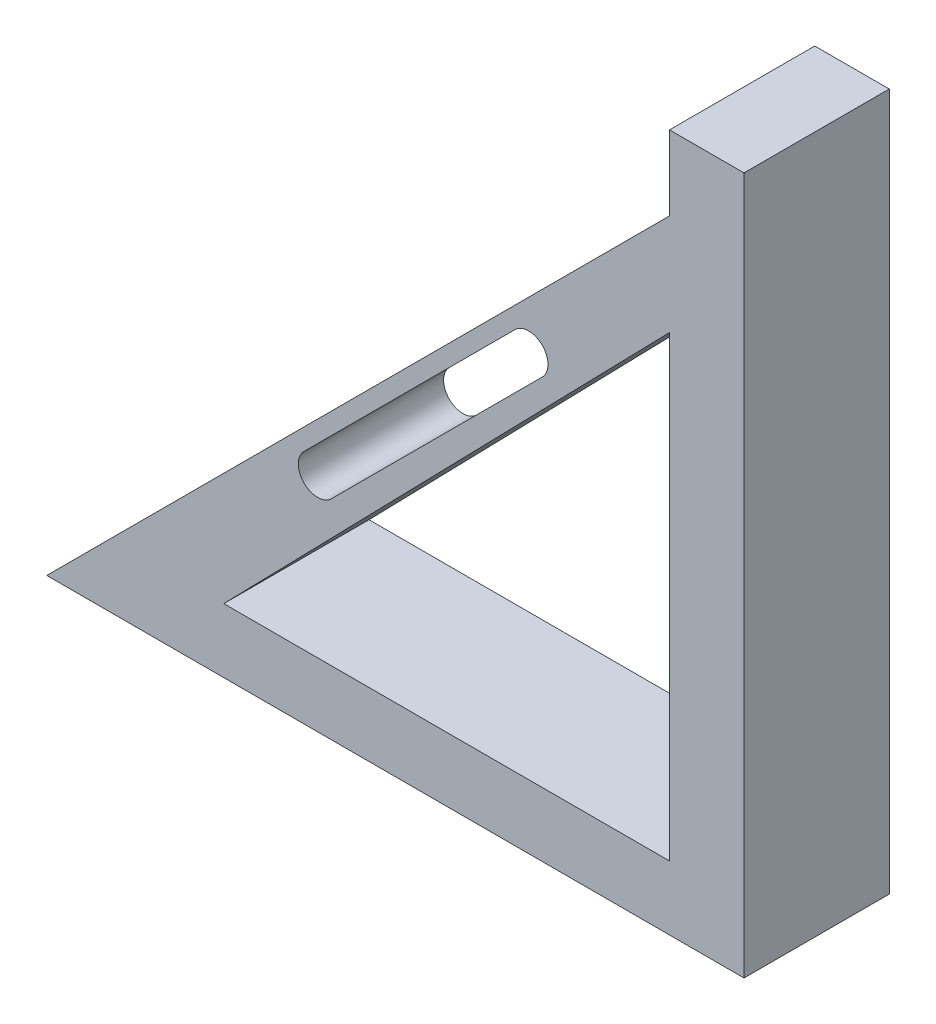
ISO-10303-21;
HEADER;
FILE_DESCRIPTION(('STEP AP214'),'2;1');
FILE_NAME('part.step','',(''),(''),'','','');
FILE_SCHEMA(('AUTOMOTIVE_DESIGN { 1 0 10303 214 1 1 1 1 }'));
ENDSEC;
DATA;
#1=APPLICATION_CONTEXT('core data for automotive mechanical design processes');
#2=APPLICATION_PROTOCOL_DEFINITION('international standard','automotive_design',2000,#1);
#3=PRODUCT_CONTEXT('',#1,'mechanical');
#4=PRODUCT('Part','Part','',(#3));
#5=PRODUCT_RELATED_PRODUCT_CATEGORY('part','',(#4));
#6=PRODUCT_DEFINITION_FORMATION('','',#4);
#7=PRODUCT_DEFINITION_CONTEXT('part definition',#1,'design');
#8=PRODUCT_DEFINITION('design','',#6,#7);
#9=PRODUCT_DEFINITION_SHAPE('','',#8);
#10=(LENGTH_UNIT() NAMED_UNIT(*) SI_UNIT(.MILLI.,.METRE.));
#11=(NAMED_UNIT(*) PLANE_ANGLE_UNIT() SI_UNIT($,.RADIAN.));
#12=(NAMED_UNIT(*) SI_UNIT($,.STERADIAN.) SOLID_ANGLE_UNIT());
#13=UNCERTAINTY_MEASURE_WITH_UNIT(LENGTH_MEASURE(1.E-05),#10,'distance_accuracy_value','');
#14=(GEOMETRIC_REPRESENTATION_CONTEXT(3) GLOBAL_UNCERTAINTY_ASSIGNED_CONTEXT((#13)) GLOBAL_UNIT_ASSIGNED_CONTEXT((#10,
#11,#12)) REPRESENTATION_CONTEXT('',''));
#15=CARTESIAN_POINT('',(0.,0.,0.));
#16=DIRECTION('',(0.,0.,1.));
#17=DIRECTION('',(1.,0.,0.));
#18=AXIS2_PLACEMENT_3D('',#15,#16,#17);
#19=CARTESIAN_POINT('',(0.,0.,25.));
#20=DIRECTION('',(0.,0.,1.));
#21=DIRECTION('',(1.,0.,0.));
#22=AXIS2_PLACEMENT_3D('',#19,#20,#21);
#23=PLANE('',#22);
#24=CARTESIAN_POINT('',(22.9410613723644,74.5825493904846,25.));
#25=DIRECTION('',(0.,0.,1.));
#26=DIRECTION('',(1.,0.,0.));
#27=AXIS2_PLACEMENT_3D('',#24,#25,#26);
#28=CIRCLE('',#27,3.32826489939381);
#29=CARTESIAN_POINT('',(25.294500052311,72.2291107105381,25.));
#30=VERTEX_POINT('',#29);
#31=CARTESIAN_POINT('',(20.5876226924178,76.9359880704311,25.));
#32=VERTEX_POINT('',#31);
#33=EDGE_CURVE('E48',#30,#32,#28,.T.);
#34=ORIENTED_EDGE('',*,*,#33,.F.);
#35=DIRECTION('',(0.707106781186541,0.707106781186554,0.));
#36=VECTOR('',#35,1.);
#37=CARTESIAN_POINT('',(25.294500052311,72.2291107105381,25.));
#38=LINE('',#37,#36);
#39=CARTESIAN_POINT('',(-11.0224268112802,35.9121838469463,25.));
#40=VERTEX_POINT('',#39);
#41=EDGE_CURVE('E140',#40,#30,#38,.T.);
#42=ORIENTED_EDGE('',*,*,#41,.F.);
#43=CARTESIAN_POINT('',(-13.3758654912267,38.2656225268928,25.));
#44=DIRECTION('',(0.,0.,1.));
#45=DIRECTION('',(1.,0.,0.));
#46=AXIS2_PLACEMENT_3D('',#43,#44,#45);
#47=CIRCLE('',#46,3.32826489939382);
#48=CARTESIAN_POINT('',(-15.7293041711733,40.6190612068393,25.));
#49=VERTEX_POINT('',#48);
#50=EDGE_CURVE('E143',#49,#40,#47,.T.);
#51=ORIENTED_EDGE('',*,*,#50,.F.);
#52=DIRECTION('',(-0.707106781186541,-0.707106781186554,0.));
#53=VECTOR('',#52,1.);
#54=CARTESIAN_POINT('',(20.5876226924179,76.9359880704311,25.));
#55=LINE('',#54,#53);
#56=EDGE_CURVE('E149',#32,#49,#55,.T.);
#57=ORIENTED_EDGE('',*,*,#56,.F.);
#58=EDGE_LOOP('',(#34,#42,#51,#57));
#59=FACE_BOUND('',#58,.T.);
#60=DIRECTION('',(0.,1.,0.));
#61=VECTOR('',#60,1.);
#62=CARTESIAN_POINT('',(60.,120.,25.));
#63=LINE('',#62,#61);
#64=CARTESIAN_POINT('',(60.,0.,25.));
#65=VERTEX_POINT('',#64);
#66=CARTESIAN_POINT('',(60.,120.,25.));
#67=VERTEX_POINT('',#66);
#68=EDGE_CURVE('E183',#65,#67,#63,.T.);
#69=ORIENTED_EDGE('',*,*,#68,.T.);
#70=DIRECTION('',(-1.,0.,0.));
#71=VECTOR('',#70,1.);
#72=CARTESIAN_POINT('',(47.1770110419047,120.,25.));
#73=LINE('',#72,#71);
#74=CARTESIAN_POINT('',(47.1770110419047,120.,25.));
#75=VERTEX_POINT('',#74);
#76=EDGE_CURVE('E186',#67,#75,#73,.T.);
#77=ORIENTED_EDGE('',*,*,#76,.T.);
#78=DIRECTION('',(0.,-1.,0.));
#79=VECTOR('',#78,1.);
#80=CARTESIAN_POINT('',(47.1770110419048,107.177011041905,25.));
#81=LINE('',#80,#79);
#82=CARTESIAN_POINT('',(47.1770110419048,107.177011041905,25.));
#83=VERTEX_POINT('',#82);
#84=EDGE_CURVE('E189',#75,#83,#81,.T.);
#85=ORIENTED_EDGE('',*,*,#84,.T.);
#86=DIRECTION('',(-0.707106781186547,-0.707106781186547,0.));
#87=VECTOR('',#86,1.);
#88=CARTESIAN_POINT('',(47.1770110419048,107.177011041905,25.));
#89=LINE('',#88,#87);
#90=CARTESIAN_POINT('',(-60.,0.,25.));
#91=VERTEX_POINT('',#90);
#92=EDGE_CURVE('E191',#83,#91,#89,.T.);
#93=ORIENTED_EDGE('',*,*,#92,.T.);
#94=DIRECTION('',(1.,0.,0.));
#95=VECTOR('',#94,1.);
#96=CARTESIAN_POINT('',(-60.,0.,25.));
#97=LINE('',#96,#95);
#98=EDGE_CURVE('E193',#91,#65,#97,.T.);
#99=ORIENTED_EDGE('',*,*,#98,.T.);
#100=EDGE_LOOP('',(#69,#77,#85,#93,#99));
#101=FACE_BOUND('',#100,.T.);
#102=DIRECTION('',(1.,0.,0.));
#103=VECTOR('',#102,1.);
#104=CARTESIAN_POINT('',(-29.533576018103,11.0330752600284,25.));
#105=LINE('',#104,#103);
#106=CARTESIAN_POINT('',(-29.533576018103,11.0330752600284,25.));
#107=VERTEX_POINT('',#106);
#108=CARTESIAN_POINT('',(47.1770110419047,11.0330752600284,25.));
#109=VERTEX_POINT('',#108);
#110=EDGE_CURVE('E161',#107,#109,#105,.T.);
#111=ORIENTED_EDGE('',*,*,#110,.F.);
#112=DIRECTION('',(-0.697742347072111,-0.7163488096607,0.));
#113=VECTOR('',#112,1.);
#114=CARTESIAN_POINT('',(47.1770110419047,89.7892779749697,25.));
#115=LINE('',#114,#113);
#116=CARTESIAN_POINT('',(47.1770110419047,89.7892779749697,25.));
#117=VERTEX_POINT('',#116);
#118=EDGE_CURVE('E159',#117,#107,#115,.T.);
#119=ORIENTED_EDGE('',*,*,#118,.F.);
#120=DIRECTION('',(0.,1.,0.));
#121=VECTOR('',#120,1.);
#122=CARTESIAN_POINT('',(47.1770110419047,89.7892779749697,25.));
#123=LINE('',#122,#121);
#124=EDGE_CURVE('E165',#109,#117,#123,.T.);
#125=ORIENTED_EDGE('',*,*,#124,.F.);
#126=EDGE_LOOP('',(#111,#119,#125));
#127=FACE_BOUND('',#126,.T.);
#128=ADVANCED_FACE('F33',(#59,#101,#127),#23,.T.);
#129=CARTESIAN_POINT('',(0.,0.,0.));
#130=DIRECTION('',(0.,0.,1.));
#131=DIRECTION('',(1.,0.,0.));
#132=AXIS2_PLACEMENT_3D('',#129,#130,#131);
#133=PLANE('',#132);
#134=DIRECTION('',(0.707106781186541,0.707106781186554,0.));
#135=VECTOR('',#134,1.);
#136=CARTESIAN_POINT('',(25.294500052311,72.2291107105381,0.));
#137=LINE('',#136,#135);
#138=CARTESIAN_POINT('',(-11.0224268112802,35.9121838469463,0.));
#139=VERTEX_POINT('',#138);
#140=CARTESIAN_POINT('',(25.294500052311,72.2291107105381,0.));
#141=VERTEX_POINT('',#140);
#142=EDGE_CURVE('E130',#139,#141,#137,.T.);
#143=ORIENTED_EDGE('',*,*,#142,.T.);
#144=CARTESIAN_POINT('',(22.9410613723644,74.5825493904846,0.));
#145=DIRECTION('',(0.,0.,1.));
#146=DIRECTION('',(1.,0.,0.));
#147=AXIS2_PLACEMENT_3D('',#144,#145,#146);
#148=CIRCLE('',#147,3.32826489939381);
#149=CARTESIAN_POINT('',(20.5876226924179,76.9359880704311,0.));
#150=VERTEX_POINT('',#149);
#151=EDGE_CURVE('E124',#141,#150,#148,.T.);
#152=ORIENTED_EDGE('',*,*,#151,.T.);
#153=DIRECTION('',(-0.707106781186541,-0.707106781186554,0.));
#154=VECTOR('',#153,1.);
#155=CARTESIAN_POINT('',(20.5876226924179,76.9359880704311,0.));
#156=LINE('',#155,#154);
#157=CARTESIAN_POINT('',(-15.7293041711733,40.6190612068393,0.));
#158=VERTEX_POINT('',#157);
#159=EDGE_CURVE('E133',#150,#158,#156,.T.);
#160=ORIENTED_EDGE('',*,*,#159,.T.);
#161=CARTESIAN_POINT('',(-13.3758654912267,38.2656225268928,0.));
#162=DIRECTION('',(0.,0.,1.));
#163=DIRECTION('',(1.,0.,0.));
#164=AXIS2_PLACEMENT_3D('',#161,#162,#163);
#165=CIRCLE('',#164,3.32826489939382);
#166=EDGE_CURVE('E56',#158,#139,#165,.T.);
#167=ORIENTED_EDGE('',*,*,#166,.T.);
#168=EDGE_LOOP('',(#143,#152,#160,#167));
#169=FACE_BOUND('',#168,.T.);
#170=DIRECTION('',(0.,1.,0.));
#171=VECTOR('',#170,1.);
#172=CARTESIAN_POINT('',(60.,120.,0.));
#173=LINE('',#172,#171);
#174=CARTESIAN_POINT('',(60.,0.,0.));
#175=VERTEX_POINT('',#174);
#176=CARTESIAN_POINT('',(60.,120.,0.));
#177=VERTEX_POINT('',#176);
#178=EDGE_CURVE('E182',#175,#177,#173,.T.);
#179=ORIENTED_EDGE('',*,*,#178,.F.);
#180=DIRECTION('',(1.,0.,0.));
#181=VECTOR('',#180,1.);
#182=CARTESIAN_POINT('',(-60.,0.,0.));
#183=LINE('',#182,#181);
#184=CARTESIAN_POINT('',(-60.,0.,0.));
#185=VERTEX_POINT('',#184);
#186=EDGE_CURVE('E187',#185,#175,#183,.T.);
#187=ORIENTED_EDGE('',*,*,#186,.F.);
#188=DIRECTION('',(-0.707106781186547,-0.707106781186547,0.));
#189=VECTOR('',#188,1.);
#190=CARTESIAN_POINT('',(47.1770110419048,107.177011041905,0.));
#191=LINE('',#190,#189);
#192=CARTESIAN_POINT('',(47.1770110419048,107.177011041905,0.));
#193=VERTEX_POINT('',#192);
#194=EDGE_CURVE('E202',#193,#185,#191,.T.);
#195=ORIENTED_EDGE('',*,*,#194,.F.);
#196=DIRECTION('',(0.,-1.,0.));
#197=VECTOR('',#196,1.);
#198=CARTESIAN_POINT('',(47.1770110419048,107.177011041905,0.));
#199=LINE('',#198,#197);
#200=CARTESIAN_POINT('',(47.1770110419047,120.,0.));
#201=VERTEX_POINT('',#200);
#202=EDGE_CURVE('E200',#201,#193,#199,.T.);
#203=ORIENTED_EDGE('',*,*,#202,.F.);
#204=DIRECTION('',(-1.,0.,0.));
#205=VECTOR('',#204,1.);
#206=CARTESIAN_POINT('',(47.1770110419047,120.,0.));
#207=LINE('',#206,#205);
#208=EDGE_CURVE('E198',#177,#201,#207,.T.);
#209=ORIENTED_EDGE('',*,*,#208,.F.);
#210=EDGE_LOOP('',(#179,#187,#195,#203,#209));
#211=FACE_BOUND('',#210,.T.);
#212=DIRECTION('',(-0.697742347072111,-0.7163488096607,0.));
#213=VECTOR('',#212,1.);
#214=CARTESIAN_POINT('',(47.1770110419047,89.7892779749697,0.));
#215=LINE('',#214,#213);
#216=CARTESIAN_POINT('',(47.1770110419047,89.7892779749697,0.));
#217=VERTEX_POINT('',#216);
#218=CARTESIAN_POINT('',(-29.533576018103,11.0330752600284,0.));
#219=VERTEX_POINT('',#218);
#220=EDGE_CURVE('E155',#217,#219,#215,.T.);
#221=ORIENTED_EDGE('',*,*,#220,.T.);
#222=DIRECTION('',(1.,0.,0.));
#223=VECTOR('',#222,1.);
#224=CARTESIAN_POINT('',(-29.533576018103,11.0330752600284,0.));
#225=LINE('',#224,#223);
#226=CARTESIAN_POINT('',(47.1770110419047,11.0330752600284,0.));
#227=VERTEX_POINT('',#226);
#228=EDGE_CURVE('E170',#219,#227,#225,.T.);
#229=ORIENTED_EDGE('',*,*,#228,.T.);
#230=DIRECTION('',(0.,1.,0.));
#231=VECTOR('',#230,1.);
#232=CARTESIAN_POINT('',(47.1770110419047,89.7892779749697,0.));
#233=LINE('',#232,#231);
#234=EDGE_CURVE('E162',#227,#217,#233,.T.);
#235=ORIENTED_EDGE('',*,*,#234,.T.);
#236=EDGE_LOOP('',(#221,#229,#235));
#237=FACE_BOUND('',#236,.T.);
#238=ADVANCED_FACE('F137',(#169,#211,#237),#133,.F.);
#239=CARTESIAN_POINT('',(60.,120.,25.));
#240=DIRECTION('',(-1.,0.,0.));
#241=DIRECTION('',(0.,-1.,0.));
#242=AXIS2_PLACEMENT_3D('',#239,#240,#241);
#243=PLANE('',#242);
#244=ORIENTED_EDGE('',*,*,#178,.T.);
#245=DIRECTION('',(0.,0.,-1.));
#246=VECTOR('',#245,1.);
#247=CARTESIAN_POINT('',(60.,120.,25.));
#248=LINE('',#247,#246);
#249=EDGE_CURVE('E11',#67,#177,#248,.T.);
#250=ORIENTED_EDGE('',*,*,#249,.F.);
#251=ORIENTED_EDGE('',*,*,#68,.F.);
#252=DIRECTION('',(0.,0.,-1.));
#253=VECTOR('',#252,1.);
#254=CARTESIAN_POINT('',(60.,0.,25.));
#255=LINE('',#254,#253);
#256=EDGE_CURVE('E195',#65,#175,#255,.T.);
#257=ORIENTED_EDGE('',*,*,#256,.T.);
#258=EDGE_LOOP('',(#244,#250,#251,#257));
#259=FACE_BOUND('',#258,.T.);
#260=ADVANCED_FACE('F35',(#259),#243,.F.);
#261=CARTESIAN_POINT('',(47.1770110419047,120.,25.));
#262=DIRECTION('',(0.,-1.,0.));
#263=DIRECTION('',(0.,0.,-1.));
#264=AXIS2_PLACEMENT_3D('',#261,#262,#263);
#265=PLANE('',#264);
#266=ORIENTED_EDGE('',*,*,#208,.T.);
#267=DIRECTION('',(0.,0.,-1.));
#268=VECTOR('',#267,1.);
#269=CARTESIAN_POINT('',(47.1770110419047,120.,25.));
#270=LINE('',#269,#268);
#271=EDGE_CURVE('E41',#75,#201,#270,.T.);
#272=ORIENTED_EDGE('',*,*,#271,.F.);
#273=ORIENTED_EDGE('',*,*,#76,.F.);
#274=ORIENTED_EDGE('',*,*,#249,.T.);
#275=EDGE_LOOP('',(#266,#272,#273,#274));
#276=FACE_BOUND('',#275,.T.);
#277=ADVANCED_FACE('F236',(#276),#265,.F.);
#278=CARTESIAN_POINT('',(47.1770110419048,107.177011041905,25.));
#279=DIRECTION('',(1.,0.,0.));
#280=DIRECTION('',(0.,1.,0.));
#281=AXIS2_PLACEMENT_3D('',#278,#279,#280);
#282=PLANE('',#281);
#283=ORIENTED_EDGE('',*,*,#202,.T.);
#284=DIRECTION('',(0.,0.,-1.));
#285=VECTOR('',#284,1.);
#286=CARTESIAN_POINT('',(47.1770110419048,107.177011041905,25.));
#287=LINE('',#286,#285);
#288=EDGE_CURVE('E210',#83,#193,#287,.T.);
#289=ORIENTED_EDGE('',*,*,#288,.F.);
#290=ORIENTED_EDGE('',*,*,#84,.F.);
#291=ORIENTED_EDGE('',*,*,#271,.T.);
#292=EDGE_LOOP('',(#283,#289,#290,#291));
#293=FACE_BOUND('',#292,.T.);
#294=ADVANCED_FACE('F217',(#293),#282,.F.);
#295=CARTESIAN_POINT('',(47.1770110419048,107.177011041905,25.));
#296=DIRECTION('',(0.707106781186547,-0.707106781186547,0.));
#297=DIRECTION('',(0.707106781186548,0.707106781186548,0.));
#298=AXIS2_PLACEMENT_3D('',#295,#296,#297);
#299=PLANE('',#298);
#300=ORIENTED_EDGE('',*,*,#194,.T.);
#301=DIRECTION('',(0.,0.,-1.));
#302=VECTOR('',#301,1.);
#303=CARTESIAN_POINT('',(-60.,0.,25.));
#304=LINE('',#303,#302);
#305=EDGE_CURVE('E207',#91,#185,#304,.T.);
#306=ORIENTED_EDGE('',*,*,#305,.F.);
#307=ORIENTED_EDGE('',*,*,#92,.F.);
#308=ORIENTED_EDGE('',*,*,#288,.T.);
#309=EDGE_LOOP('',(#300,#306,#307,#308));
#310=FACE_BOUND('',#309,.T.);
#311=ADVANCED_FACE('F226',(#310),#299,.F.);
#312=CARTESIAN_POINT('',(-60.,0.,25.));
#313=DIRECTION('',(0.,1.,0.));
#314=DIRECTION('',(0.,0.,1.));
#315=AXIS2_PLACEMENT_3D('',#312,#313,#314);
#316=PLANE('',#315);
#317=ORIENTED_EDGE('',*,*,#186,.T.);
#318=ORIENTED_EDGE('',*,*,#256,.F.);
#319=ORIENTED_EDGE('',*,*,#98,.F.);
#320=ORIENTED_EDGE('',*,*,#305,.T.);
#321=EDGE_LOOP('',(#317,#318,#319,#320));
#322=FACE_BOUND('',#321,.T.);
#323=ADVANCED_FACE('F230',(#322),#316,.F.);
#324=CARTESIAN_POINT('',(47.1770110419047,89.7892779749697,25.));
#325=DIRECTION('',(0.7163488096607,-0.697742347072111,0.));
#326=DIRECTION('',(0.697742347072111,0.7163488096607,0.));
#327=AXIS2_PLACEMENT_3D('',#324,#325,#326);
#328=PLANE('',#327);
#329=ORIENTED_EDGE('',*,*,#220,.F.);
#330=DIRECTION('',(0.,0.,-1.));
#331=VECTOR('',#330,1.);
#332=CARTESIAN_POINT('',(47.1770110419047,89.7892779749697,25.));
#333=LINE('',#332,#331);
#334=EDGE_CURVE('E167',#117,#217,#333,.T.);
#335=ORIENTED_EDGE('',*,*,#334,.F.);
#336=ORIENTED_EDGE('',*,*,#118,.T.);
#337=DIRECTION('',(0.,0.,-1.));
#338=VECTOR('',#337,1.);
#339=CARTESIAN_POINT('',(-29.533576018103,11.0330752600284,25.));
#340=LINE('',#339,#338);
#341=EDGE_CURVE('E179',#107,#219,#340,.T.);
#342=ORIENTED_EDGE('',*,*,#341,.T.);
#343=EDGE_LOOP('',(#329,#335,#336,#342));
#344=FACE_BOUND('',#343,.T.);
#345=ADVANCED_FACE('F250',(#344),#328,.T.);
#346=CARTESIAN_POINT('',(-29.533576018103,11.0330752600284,25.));
#347=DIRECTION('',(0.,1.,0.));
#348=DIRECTION('',(0.,0.,1.));
#349=AXIS2_PLACEMENT_3D('',#346,#347,#348);
#350=PLANE('',#349);
#351=ORIENTED_EDGE('',*,*,#228,.F.);
#352=ORIENTED_EDGE('',*,*,#341,.F.);
#353=ORIENTED_EDGE('',*,*,#110,.T.);
#354=DIRECTION('',(0.,0.,-1.));
#355=VECTOR('',#354,1.);
#356=CARTESIAN_POINT('',(47.1770110419047,11.0330752600284,25.));
#357=LINE('',#356,#355);
#358=EDGE_CURVE('E177',#109,#227,#357,.T.);
#359=ORIENTED_EDGE('',*,*,#358,.T.);
#360=EDGE_LOOP('',(#351,#352,#353,#359));
#361=FACE_BOUND('',#360,.T.);
#362=ADVANCED_FACE('F276',(#361),#350,.T.);
#363=CARTESIAN_POINT('',(47.1770110419047,89.7892779749697,25.));
#364=DIRECTION('',(-1.,0.,0.));
#365=DIRECTION('',(0.,0.,1.));
#366=AXIS2_PLACEMENT_3D('',#363,#364,#365);
#367=PLANE('',#366);
#368=ORIENTED_EDGE('',*,*,#234,.F.);
#369=ORIENTED_EDGE('',*,*,#358,.F.);
#370=ORIENTED_EDGE('',*,*,#124,.T.);
#371=ORIENTED_EDGE('',*,*,#334,.T.);
#372=EDGE_LOOP('',(#368,#369,#370,#371));
#373=FACE_BOUND('',#372,.T.);
#374=ADVANCED_FACE('F283',(#373),#367,.T.);
#375=CARTESIAN_POINT('',(22.9410613723644,74.5825493904846,0.));
#376=DIRECTION('',(0.,0.,1.));
#377=DIRECTION('',(1.,0.,0.));
#378=AXIS2_PLACEMENT_3D('',#375,#376,#377);
#379=CYLINDRICAL_SURFACE('',#378,3.32826489939381);
#380=ORIENTED_EDGE('',*,*,#33,.T.);
#381=DIRECTION('',(0.,0.,1.));
#382=VECTOR('',#381,1.);
#383=CARTESIAN_POINT('',(20.5876226924179,76.9359880704311,0.));
#384=LINE('',#383,#382);
#385=EDGE_CURVE('E120',#150,#32,#384,.T.);
#386=ORIENTED_EDGE('',*,*,#385,.F.);
#387=ORIENTED_EDGE('',*,*,#151,.F.);
#388=DIRECTION('',(0.,0.,1.));
#389=VECTOR('',#388,1.);
#390=CARTESIAN_POINT('',(25.294500052311,72.2291107105381,0.));
#391=LINE('',#390,#389);
#392=EDGE_CURVE('E153',#141,#30,#391,.T.);
#393=ORIENTED_EDGE('',*,*,#392,.T.);
#394=EDGE_LOOP('',(#380,#386,#387,#393));
#395=FACE_BOUND('',#394,.T.);
#396=ADVANCED_FACE('F122',(#395),#379,.F.);
#397=CARTESIAN_POINT('',(25.294500052311,72.2291107105381,0.));
#398=DIRECTION('',(0.707106781186554,-0.707106781186541,0.));
#399=DIRECTION('',(0.707106781186541,0.707106781186554,0.));
#400=AXIS2_PLACEMENT_3D('',#397,#398,#399);
#401=PLANE('',#400);
#402=ORIENTED_EDGE('',*,*,#41,.T.);
#403=ORIENTED_EDGE('',*,*,#392,.F.);
#404=ORIENTED_EDGE('',*,*,#142,.F.);
#405=DIRECTION('',(0.,0.,1.));
#406=VECTOR('',#405,1.);
#407=CARTESIAN_POINT('',(-11.0224268112802,35.9121838469463,0.));
#408=LINE('',#407,#406);
#409=EDGE_CURVE('E156',#139,#40,#408,.T.);
#410=ORIENTED_EDGE('',*,*,#409,.T.);
#411=EDGE_LOOP('',(#402,#403,#404,#410));
#412=FACE_BOUND('',#411,.T.);
#413=ADVANCED_FACE('F297',(#412),#401,.F.);
#414=CARTESIAN_POINT('',(-13.3758654912267,38.2656225268928,0.));
#415=DIRECTION('',(0.,0.,1.));
#416=DIRECTION('',(1.,0.,0.));
#417=AXIS2_PLACEMENT_3D('',#414,#415,#416);
#418=CYLINDRICAL_SURFACE('',#417,3.32826489939382);
#419=ORIENTED_EDGE('',*,*,#50,.T.);
#420=ORIENTED_EDGE('',*,*,#409,.F.);
#421=ORIENTED_EDGE('',*,*,#166,.F.);
#422=DIRECTION('',(0.,0.,1.));
#423=VECTOR('',#422,1.);
#424=CARTESIAN_POINT('',(-15.7293041711733,40.6190612068393,0.));
#425=LINE('',#424,#423);
#426=EDGE_CURVE('E129',#158,#49,#425,.T.);
#427=ORIENTED_EDGE('',*,*,#426,.T.);
#428=EDGE_LOOP('',(#419,#420,#421,#427));
#429=FACE_BOUND('',#428,.T.);
#430=ADVANCED_FACE('F305',(#429),#418,.F.);
#431=CARTESIAN_POINT('',(20.5876226924179,76.9359880704311,0.));
#432=DIRECTION('',(-0.707106781186554,0.707106781186541,0.));
#433=DIRECTION('',(-0.707106781186541,-0.707106781186554,0.));
#434=AXIS2_PLACEMENT_3D('',#431,#432,#433);
#435=PLANE('',#434);
#436=ORIENTED_EDGE('',*,*,#56,.T.);
#437=ORIENTED_EDGE('',*,*,#426,.F.);
#438=ORIENTED_EDGE('',*,*,#159,.F.);
#439=ORIENTED_EDGE('',*,*,#385,.T.);
#440=EDGE_LOOP('',(#436,#437,#438,#439));
#441=FACE_BOUND('',#440,.T.);
#442=ADVANCED_FACE('F134',(#441),#435,.F.);
#443=CLOSED_SHELL('',(#128,#238,#260,#277,#294,#311,#323,#345,#362,#374,#396,#413,#430,#442));
#444=MANIFOLD_SOLID_BREP('B2',#443);
#445=ADVANCED_BREP_SHAPE_REPRESENTATION('',(#18,#444),#14);
#446=SHAPE_DEFINITION_REPRESENTATION(#9,#445);
ENDSEC;
END-ISO-10303-21;
